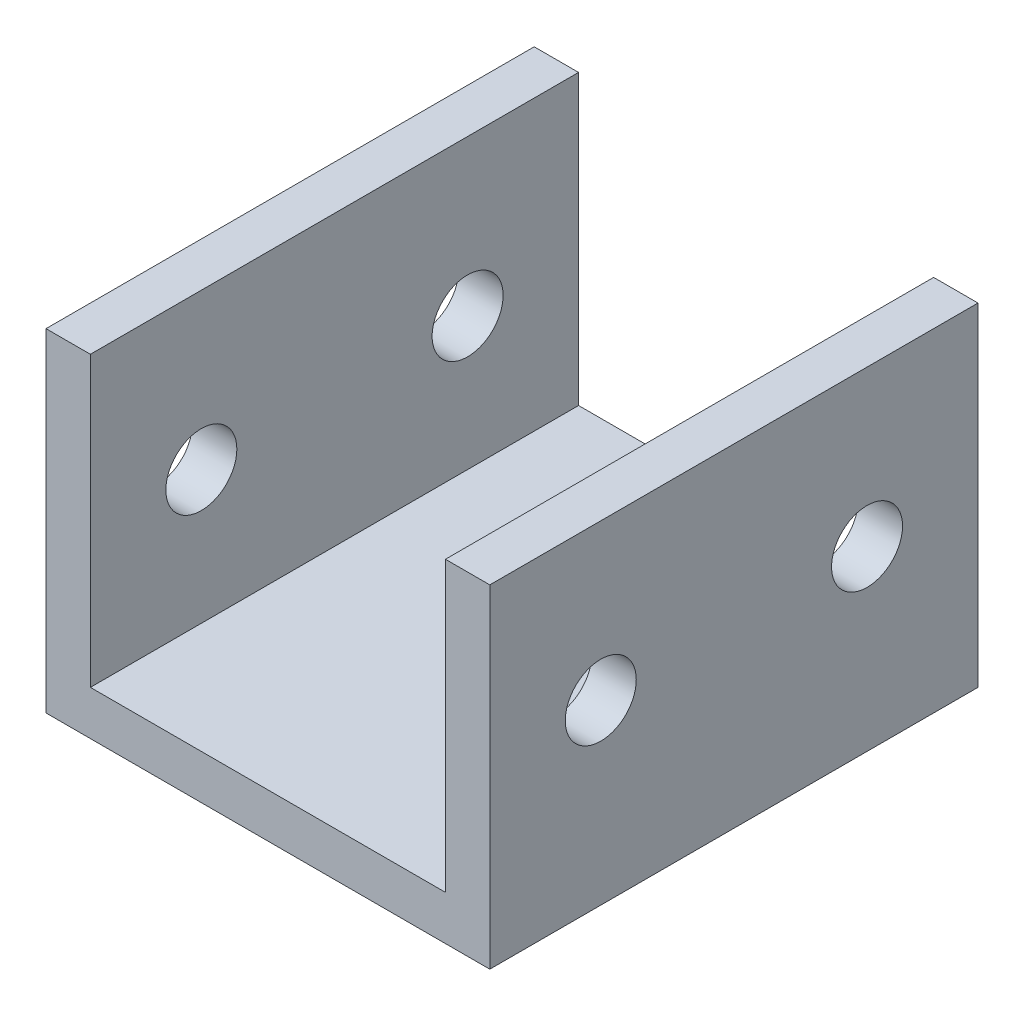
ISO-10303-21;
HEADER;
FILE_DESCRIPTION(('STEP AP214'),'2;1');
FILE_NAME('part.step','',(''),(''),'','','');
FILE_SCHEMA(('AUTOMOTIVE_DESIGN { 1 0 10303 214 1 1 1 1 }'));
ENDSEC;
DATA;
#1=APPLICATION_CONTEXT('core data for automotive mechanical design processes');
#2=APPLICATION_PROTOCOL_DEFINITION('international standard','automotive_design',2000,#1);
#3=PRODUCT_CONTEXT('',#1,'mechanical');
#4=PRODUCT('Part','Part','',(#3));
#5=PRODUCT_RELATED_PRODUCT_CATEGORY('part','',(#4));
#6=PRODUCT_DEFINITION_FORMATION('','',#4);
#7=PRODUCT_DEFINITION_CONTEXT('part definition',#1,'design');
#8=PRODUCT_DEFINITION('design','',#6,#7);
#9=PRODUCT_DEFINITION_SHAPE('','',#8);
#10=(LENGTH_UNIT() NAMED_UNIT(*) SI_UNIT(.MILLI.,.METRE.));
#11=(NAMED_UNIT(*) PLANE_ANGLE_UNIT() SI_UNIT($,.RADIAN.));
#12=(NAMED_UNIT(*) SI_UNIT($,.STERADIAN.) SOLID_ANGLE_UNIT());
#13=UNCERTAINTY_MEASURE_WITH_UNIT(LENGTH_MEASURE(1.E-05),#10,'distance_accuracy_value','');
#14=(GEOMETRIC_REPRESENTATION_CONTEXT(3) GLOBAL_UNCERTAINTY_ASSIGNED_CONTEXT((#13)) GLOBAL_UNIT_ASSIGNED_CONTEXT((#10,
#11,#12)) REPRESENTATION_CONTEXT('',''));
#15=CARTESIAN_POINT('',(0.,0.,0.));
#16=DIRECTION('',(0.,0.,1.));
#17=DIRECTION('',(1.,0.,0.));
#18=AXIS2_PLACEMENT_3D('',#15,#16,#17);
#19=CARTESIAN_POINT('',(9.99999999999999,0.,22.));
#20=DIRECTION('',(-1.,0.,0.));
#21=DIRECTION('',(0.,-1.,0.));
#22=AXIS2_PLACEMENT_3D('',#19,#20,#21);
#23=PLANE('',#22);
#24=CARTESIAN_POINT('',(10.,8.,5.));
#25=DIRECTION('',(1.,0.,0.));
#26=DIRECTION('',(0.,0.,-1.));
#27=AXIS2_PLACEMENT_3D('',#24,#25,#26);
#28=CIRCLE('',#27,1.6);
#29=CARTESIAN_POINT('',(10.,8.,3.4));
#30=VERTEX_POINT('',#29);
#31=EDGE_CURVE('E204',#30,#30,#28,.T.);
#32=ORIENTED_EDGE('',*,*,#31,.F.);
#33=EDGE_LOOP('',(#32));
#34=FACE_BOUND('',#33,.T.);
#35=DIRECTION('',(0.,1.,0.));
#36=VECTOR('',#35,1.);
#37=CARTESIAN_POINT('',(9.99999999999999,0.,0.));
#38=LINE('',#37,#36);
#39=CARTESIAN_POINT('',(9.99999999999999,0.,0.));
#40=VERTEX_POINT('',#39);
#41=CARTESIAN_POINT('',(10.,15.,0.));
#42=VERTEX_POINT('',#41);
#43=EDGE_CURVE('E100',#40,#42,#38,.T.);
#44=ORIENTED_EDGE('',*,*,#43,.T.);
#45=DIRECTION('',(0.,0.,-1.));
#46=VECTOR('',#45,1.);
#47=CARTESIAN_POINT('',(10.,15.,22.));
#48=LINE('',#47,#46);
#49=CARTESIAN_POINT('',(10.,15.,22.));
#50=VERTEX_POINT('',#49);
#51=EDGE_CURVE('E11',#50,#42,#48,.T.);
#52=ORIENTED_EDGE('',*,*,#51,.F.);
#53=DIRECTION('',(0.,1.,0.));
#54=VECTOR('',#53,1.);
#55=CARTESIAN_POINT('',(9.99999999999999,0.,22.));
#56=LINE('',#55,#54);
#57=CARTESIAN_POINT('',(9.99999999999999,0.,22.));
#58=VERTEX_POINT('',#57);
#59=EDGE_CURVE('E137',#58,#50,#56,.T.);
#60=ORIENTED_EDGE('',*,*,#59,.F.);
#61=DIRECTION('',(0.,0.,-1.));
#62=VECTOR('',#61,1.);
#63=CARTESIAN_POINT('',(9.99999999999999,0.,22.));
#64=LINE('',#63,#62);
#65=EDGE_CURVE('E114',#58,#40,#64,.T.);
#66=ORIENTED_EDGE('',*,*,#65,.T.);
#67=EDGE_LOOP('',(#44,#52,#60,#66));
#68=FACE_BOUND('',#67,.T.);
#69=CARTESIAN_POINT('',(10.,8.,17.));
#70=DIRECTION('',(1.,0.,0.));
#71=DIRECTION('',(0.,0.,-1.));
#72=AXIS2_PLACEMENT_3D('',#69,#70,#71);
#73=CIRCLE('',#72,1.6);
#74=CARTESIAN_POINT('',(10.,8.,15.4));
#75=VERTEX_POINT('',#74);
#76=EDGE_CURVE('E301',#75,#75,#73,.T.);
#77=ORIENTED_EDGE('',*,*,#76,.F.);
#78=EDGE_LOOP('',(#77));
#79=FACE_BOUND('',#78,.T.);
#80=ADVANCED_FACE('F30',(#34,#68,#79),#23,.F.);
#81=CARTESIAN_POINT('',(8.,15.,22.));
#82=DIRECTION('',(1.,0.,0.));
#83=DIRECTION('',(0.,1.,0.));
#84=AXIS2_PLACEMENT_3D('',#81,#82,#83);
#85=PLANE('',#84);
#86=CARTESIAN_POINT('',(8.,8.,5.));
#87=DIRECTION('',(1.,0.,0.));
#88=DIRECTION('',(0.,1.,0.));
#89=AXIS2_PLACEMENT_3D('',#86,#87,#88);
#90=CIRCLE('',#89,1.6);
#91=CARTESIAN_POINT('',(8.,9.6,5.));
#92=VERTEX_POINT('',#91);
#93=EDGE_CURVE('E115',#92,#92,#90,.F.);
#94=ORIENTED_EDGE('',*,*,#93,.F.);
#95=EDGE_LOOP('',(#94));
#96=FACE_BOUND('',#95,.T.);
#97=DIRECTION('',(0.,-1.,0.));
#98=VECTOR('',#97,1.);
#99=CARTESIAN_POINT('',(8.,15.,0.));
#100=LINE('',#99,#98);
#101=CARTESIAN_POINT('',(8.,15.,0.));
#102=VERTEX_POINT('',#101);
#103=CARTESIAN_POINT('',(8.,2.,0.));
#104=VERTEX_POINT('',#103);
#105=EDGE_CURVE('E102',#102,#104,#100,.T.);
#106=ORIENTED_EDGE('',*,*,#105,.T.);
#107=DIRECTION('',(0.,0.,-1.));
#108=VECTOR('',#107,1.);
#109=CARTESIAN_POINT('',(8.,2.,22.));
#110=LINE('',#109,#108);
#111=CARTESIAN_POINT('',(8.,2.,22.));
#112=VERTEX_POINT('',#111);
#113=EDGE_CURVE('E161',#112,#104,#110,.T.);
#114=ORIENTED_EDGE('',*,*,#113,.F.);
#115=DIRECTION('',(0.,-1.,0.));
#116=VECTOR('',#115,1.);
#117=CARTESIAN_POINT('',(8.,15.,22.));
#118=LINE('',#117,#116);
#119=CARTESIAN_POINT('',(8.,15.,22.));
#120=VERTEX_POINT('',#119);
#121=EDGE_CURVE('E140',#120,#112,#118,.T.);
#122=ORIENTED_EDGE('',*,*,#121,.F.);
#123=DIRECTION('',(0.,0.,-1.));
#124=VECTOR('',#123,1.);
#125=CARTESIAN_POINT('',(8.,15.,22.));
#126=LINE('',#125,#124);
#127=EDGE_CURVE('E37',#120,#102,#126,.T.);
#128=ORIENTED_EDGE('',*,*,#127,.T.);
#129=EDGE_LOOP('',(#106,#114,#122,#128));
#130=FACE_BOUND('',#129,.T.);
#131=CARTESIAN_POINT('',(8.,8.,17.));
#132=DIRECTION('',(1.,0.,0.));
#133=DIRECTION('',(0.,1.,0.));
#134=AXIS2_PLACEMENT_3D('',#131,#132,#133);
#135=CIRCLE('',#134,1.6);
#136=CARTESIAN_POINT('',(8.,9.6,17.));
#137=VERTEX_POINT('',#136);
#138=EDGE_CURVE('E207',#137,#137,#135,.F.);
#139=ORIENTED_EDGE('',*,*,#138,.F.);
#140=EDGE_LOOP('',(#139));
#141=FACE_BOUND('',#140,.T.);
#142=ADVANCED_FACE('F165',(#96,#130,#141),#85,.F.);
#143=CARTESIAN_POINT('',(-8.00000000000001,15.,22.));
#144=DIRECTION('',(1.,0.,0.));
#145=DIRECTION('',(0.,0.,-1.));
#146=AXIS2_PLACEMENT_3D('',#143,#144,#145);
#147=PLANE('',#146);
#148=CARTESIAN_POINT('',(-8.00000000000001,8.,5.));
#149=DIRECTION('',(1.,0.,0.));
#150=DIRECTION('',(0.,0.,-1.));
#151=AXIS2_PLACEMENT_3D('',#148,#149,#150);
#152=CIRCLE('',#151,1.6);
#153=CARTESIAN_POINT('',(-8.00000000000001,8.,3.4));
#154=VERTEX_POINT('',#153);
#155=EDGE_CURVE('E118',#154,#154,#152,.F.);
#156=ORIENTED_EDGE('',*,*,#155,.T.);
#157=EDGE_LOOP('',(#156));
#158=FACE_BOUND('',#157,.T.);
#159=DIRECTION('',(0.,-1.,0.));
#160=VECTOR('',#159,1.);
#161=CARTESIAN_POINT('',(-8.00000000000001,15.,0.));
#162=LINE('',#161,#160);
#163=CARTESIAN_POINT('',(-8.00000000000001,15.,0.));
#164=VERTEX_POINT('',#163);
#165=CARTESIAN_POINT('',(-8.00000000000001,2.,0.));
#166=VERTEX_POINT('',#165);
#167=EDGE_CURVE('E126',#164,#166,#162,.T.);
#168=ORIENTED_EDGE('',*,*,#167,.F.);
#169=DIRECTION('',(0.,0.,-1.));
#170=VECTOR('',#169,1.);
#171=CARTESIAN_POINT('',(-8.00000000000001,15.,22.));
#172=LINE('',#171,#170);
#173=CARTESIAN_POINT('',(-8.00000000000001,15.,22.));
#174=VERTEX_POINT('',#173);
#175=EDGE_CURVE('E157',#174,#164,#172,.T.);
#176=ORIENTED_EDGE('',*,*,#175,.F.);
#177=DIRECTION('',(0.,-1.,0.));
#178=VECTOR('',#177,1.);
#179=CARTESIAN_POINT('',(-8.00000000000001,15.,22.));
#180=LINE('',#179,#178);
#181=CARTESIAN_POINT('',(-8.00000000000001,2.,22.));
#182=VERTEX_POINT('',#181);
#183=EDGE_CURVE('E144',#174,#182,#180,.T.);
#184=ORIENTED_EDGE('',*,*,#183,.T.);
#185=DIRECTION('',(0.,0.,-1.));
#186=VECTOR('',#185,1.);
#187=CARTESIAN_POINT('',(-8.00000000000001,2.,22.));
#188=LINE('',#187,#186);
#189=EDGE_CURVE('E159',#182,#166,#188,.T.);
#190=ORIENTED_EDGE('',*,*,#189,.T.);
#191=EDGE_LOOP('',(#168,#176,#184,#190));
#192=FACE_BOUND('',#191,.T.);
#193=CARTESIAN_POINT('',(-8.00000000000001,8.,17.));
#194=DIRECTION('',(1.,0.,0.));
#195=DIRECTION('',(0.,0.,-1.));
#196=AXIS2_PLACEMENT_3D('',#193,#194,#195);
#197=CIRCLE('',#196,1.6);
#198=CARTESIAN_POINT('',(-8.00000000000001,8.,15.4));
#199=VERTEX_POINT('',#198);
#200=EDGE_CURVE('E212',#199,#199,#197,.F.);
#201=ORIENTED_EDGE('',*,*,#200,.T.);
#202=EDGE_LOOP('',(#201));
#203=FACE_BOUND('',#202,.T.);
#204=ADVANCED_FACE('F177',(#158,#192,#203),#147,.T.);
#205=CARTESIAN_POINT('',(-10.,0.,22.));
#206=DIRECTION('',(-1.,0.,0.));
#207=DIRECTION('',(0.,-1.,0.));
#208=AXIS2_PLACEMENT_3D('',#205,#206,#207);
#209=PLANE('',#208);
#210=CARTESIAN_POINT('',(-10.,8.,5.));
#211=DIRECTION('',(1.,0.,0.));
#212=DIRECTION('',(0.,0.,-1.));
#213=AXIS2_PLACEMENT_3D('',#210,#211,#212);
#214=CIRCLE('',#213,1.6);
#215=CARTESIAN_POINT('',(-10.,8.,3.4));
#216=VERTEX_POINT('',#215);
#217=EDGE_CURVE('E206',#216,#216,#214,.T.);
#218=ORIENTED_EDGE('',*,*,#217,.T.);
#219=EDGE_LOOP('',(#218));
#220=FACE_BOUND('',#219,.T.);
#221=DIRECTION('',(0.,1.,0.));
#222=VECTOR('',#221,1.);
#223=CARTESIAN_POINT('',(-10.,0.,0.));
#224=LINE('',#223,#222);
#225=CARTESIAN_POINT('',(-10.,0.,0.));
#226=VERTEX_POINT('',#225);
#227=CARTESIAN_POINT('',(-10.,15.,0.));
#228=VERTEX_POINT('',#227);
#229=EDGE_CURVE('E132',#226,#228,#224,.T.);
#230=ORIENTED_EDGE('',*,*,#229,.F.);
#231=DIRECTION('',(0.,0.,-1.));
#232=VECTOR('',#231,1.);
#233=CARTESIAN_POINT('',(-10.,0.,22.));
#234=LINE('',#233,#232);
#235=CARTESIAN_POINT('',(-10.,0.,22.));
#236=VERTEX_POINT('',#235);
#237=EDGE_CURVE('E52',#236,#226,#234,.T.);
#238=ORIENTED_EDGE('',*,*,#237,.F.);
#239=DIRECTION('',(0.,1.,0.));
#240=VECTOR('',#239,1.);
#241=CARTESIAN_POINT('',(-10.,0.,22.));
#242=LINE('',#241,#240);
#243=CARTESIAN_POINT('',(-10.,15.,22.));
#244=VERTEX_POINT('',#243);
#245=EDGE_CURVE('E150',#236,#244,#242,.T.);
#246=ORIENTED_EDGE('',*,*,#245,.T.);
#247=DIRECTION('',(0.,0.,-1.));
#248=VECTOR('',#247,1.);
#249=CARTESIAN_POINT('',(-10.,15.,22.));
#250=LINE('',#249,#248);
#251=EDGE_CURVE('E155',#244,#228,#250,.T.);
#252=ORIENTED_EDGE('',*,*,#251,.T.);
#253=EDGE_LOOP('',(#230,#238,#246,#252));
#254=FACE_BOUND('',#253,.T.);
#255=CARTESIAN_POINT('',(-10.,8.,17.));
#256=DIRECTION('',(1.,0.,0.));
#257=DIRECTION('',(0.,0.,-1.));
#258=AXIS2_PLACEMENT_3D('',#255,#256,#257);
#259=CIRCLE('',#258,1.6);
#260=CARTESIAN_POINT('',(-10.,8.,15.4));
#261=VERTEX_POINT('',#260);
#262=EDGE_CURVE('E303',#261,#261,#259,.T.);
#263=ORIENTED_EDGE('',*,*,#262,.T.);
#264=EDGE_LOOP('',(#263));
#265=FACE_BOUND('',#264,.T.);
#266=ADVANCED_FACE('F182',(#220,#254,#265),#209,.T.);
#267=CARTESIAN_POINT('',(10.,15.,22.));
#268=DIRECTION('',(0.,-1.,0.));
#269=DIRECTION('',(0.,0.,-1.));
#270=AXIS2_PLACEMENT_3D('',#267,#268,#269);
#271=PLANE('',#270);
#272=DIRECTION('',(-1.,0.,0.));
#273=VECTOR('',#272,1.);
#274=CARTESIAN_POINT('',(10.,15.,0.));
#275=LINE('',#274,#273);
#276=EDGE_CURVE('E96',#42,#102,#275,.T.);
#277=ORIENTED_EDGE('',*,*,#276,.T.);
#278=ORIENTED_EDGE('',*,*,#127,.F.);
#279=DIRECTION('',(-1.,0.,0.));
#280=VECTOR('',#279,1.);
#281=CARTESIAN_POINT('',(10.,15.,22.));
#282=LINE('',#281,#280);
#283=EDGE_CURVE('E109',#50,#120,#282,.T.);
#284=ORIENTED_EDGE('',*,*,#283,.F.);
#285=ORIENTED_EDGE('',*,*,#51,.T.);
#286=EDGE_LOOP('',(#277,#278,#284,#285));
#287=FACE_BOUND('',#286,.T.);
#288=ADVANCED_FACE('F108',(#287),#271,.F.);
#289=CARTESIAN_POINT('',(8.,2.,22.));
#290=DIRECTION('',(0.,-1.,0.));
#291=DIRECTION('',(1.,0.,0.));
#292=AXIS2_PLACEMENT_3D('',#289,#290,#291);
#293=PLANE('',#292);
#294=DIRECTION('',(-1.,0.,0.));
#295=VECTOR('',#294,1.);
#296=CARTESIAN_POINT('',(8.,2.,0.));
#297=LINE('',#296,#295);
#298=EDGE_CURVE('E123',#104,#166,#297,.T.);
#299=ORIENTED_EDGE('',*,*,#298,.T.);
#300=ORIENTED_EDGE('',*,*,#189,.F.);
#301=DIRECTION('',(-1.,0.,0.));
#302=VECTOR('',#301,1.);
#303=CARTESIAN_POINT('',(8.,2.,22.));
#304=LINE('',#303,#302);
#305=EDGE_CURVE('E142',#112,#182,#304,.T.);
#306=ORIENTED_EDGE('',*,*,#305,.F.);
#307=ORIENTED_EDGE('',*,*,#113,.T.);
#308=EDGE_LOOP('',(#299,#300,#306,#307));
#309=FACE_BOUND('',#308,.T.);
#310=ADVANCED_FACE('F174',(#309),#293,.F.);
#311=CARTESIAN_POINT('',(-10.,15.,22.));
#312=DIRECTION('',(0.,1.,0.));
#313=DIRECTION('',(0.,0.,1.));
#314=AXIS2_PLACEMENT_3D('',#311,#312,#313);
#315=PLANE('',#314);
#316=DIRECTION('',(1.,0.,0.));
#317=VECTOR('',#316,1.);
#318=CARTESIAN_POINT('',(-10.,15.,0.));
#319=LINE('',#318,#317);
#320=EDGE_CURVE('E129',#228,#164,#319,.T.);
#321=ORIENTED_EDGE('',*,*,#320,.F.);
#322=ORIENTED_EDGE('',*,*,#251,.F.);
#323=DIRECTION('',(1.,0.,0.));
#324=VECTOR('',#323,1.);
#325=CARTESIAN_POINT('',(-10.,15.,22.));
#326=LINE('',#325,#324);
#327=EDGE_CURVE('E147',#244,#174,#326,.T.);
#328=ORIENTED_EDGE('',*,*,#327,.T.);
#329=ORIENTED_EDGE('',*,*,#175,.T.);
#330=EDGE_LOOP('',(#321,#322,#328,#329));
#331=FACE_BOUND('',#330,.T.);
#332=ADVANCED_FACE('F181',(#331),#315,.T.);
#333=CARTESIAN_POINT('',(-10.,0.,22.));
#334=DIRECTION('',(0.,1.,0.));
#335=DIRECTION('',(-1.,0.,0.));
#336=AXIS2_PLACEMENT_3D('',#333,#334,#335);
#337=PLANE('',#336);
#338=DIRECTION('',(1.,0.,0.));
#339=VECTOR('',#338,1.);
#340=CARTESIAN_POINT('',(-10.,0.,0.));
#341=LINE('',#340,#339);
#342=EDGE_CURVE('E135',#226,#40,#341,.T.);
#343=ORIENTED_EDGE('',*,*,#342,.T.);
#344=ORIENTED_EDGE('',*,*,#65,.F.);
#345=DIRECTION('',(1.,0.,0.));
#346=VECTOR('',#345,1.);
#347=CARTESIAN_POINT('',(-10.,0.,22.));
#348=LINE('',#347,#346);
#349=EDGE_CURVE('E44',#236,#58,#348,.T.);
#350=ORIENTED_EDGE('',*,*,#349,.F.);
#351=ORIENTED_EDGE('',*,*,#237,.T.);
#352=EDGE_LOOP('',(#343,#344,#350,#351));
#353=FACE_BOUND('',#352,.T.);
#354=ADVANCED_FACE('F185',(#353),#337,.F.);
#355=CARTESIAN_POINT('',(9.99999999999999,0.,22.));
#356=DIRECTION('',(0.,0.,-1.));
#357=DIRECTION('',(-1.,0.,0.));
#358=AXIS2_PLACEMENT_3D('',#355,#356,#357);
#359=PLANE('',#358);
#360=ORIENTED_EDGE('',*,*,#59,.T.);
#361=ORIENTED_EDGE('',*,*,#283,.T.);
#362=ORIENTED_EDGE('',*,*,#121,.T.);
#363=ORIENTED_EDGE('',*,*,#305,.T.);
#364=ORIENTED_EDGE('',*,*,#183,.F.);
#365=ORIENTED_EDGE('',*,*,#327,.F.);
#366=ORIENTED_EDGE('',*,*,#245,.F.);
#367=ORIENTED_EDGE('',*,*,#349,.T.);
#368=EDGE_LOOP('',(#360,#361,#362,#363,#364,#365,#366,#367));
#369=FACE_BOUND('',#368,.T.);
#370=ADVANCED_FACE('F169',(#369),#359,.F.);
#371=CARTESIAN_POINT('',(9.99999999999999,0.,0.));
#372=DIRECTION('',(0.,0.,-1.));
#373=DIRECTION('',(-1.,0.,0.));
#374=AXIS2_PLACEMENT_3D('',#371,#372,#373);
#375=PLANE('',#374);
#376=ORIENTED_EDGE('',*,*,#43,.F.);
#377=ORIENTED_EDGE('',*,*,#342,.F.);
#378=ORIENTED_EDGE('',*,*,#229,.T.);
#379=ORIENTED_EDGE('',*,*,#320,.T.);
#380=ORIENTED_EDGE('',*,*,#167,.T.);
#381=ORIENTED_EDGE('',*,*,#298,.F.);
#382=ORIENTED_EDGE('',*,*,#105,.F.);
#383=ORIENTED_EDGE('',*,*,#276,.F.);
#384=EDGE_LOOP('',(#376,#377,#378,#379,#380,#381,#382,#383));
#385=FACE_BOUND('',#384,.T.);
#386=ADVANCED_FACE('F97',(#385),#375,.T.);
#387=CARTESIAN_POINT('',(10.,8.,5.));
#388=DIRECTION('',(1.,0.,0.));
#389=DIRECTION('',(0.,0.,-1.));
#390=AXIS2_PLACEMENT_3D('',#387,#388,#389);
#391=CYLINDRICAL_SURFACE('',#390,1.6);
#392=ORIENTED_EDGE('',*,*,#155,.F.);
#393=EDGE_LOOP('',(#392));
#394=FACE_BOUND('',#393,.T.);
#395=ORIENTED_EDGE('',*,*,#217,.F.);
#396=EDGE_LOOP('',(#395));
#397=FACE_BOUND('',#396,.T.);
#398=ADVANCED_FACE('F219',(#394,#397),#391,.F.);
#399=ORIENTED_EDGE('',*,*,#31,.T.);
#400=EDGE_LOOP('',(#399));
#401=FACE_BOUND('',#400,.T.);
#402=ORIENTED_EDGE('',*,*,#93,.T.);
#403=EDGE_LOOP('',(#402));
#404=FACE_BOUND('',#403,.T.);
#405=ADVANCED_FACE('F222',(#401,#404),#391,.F.);
#406=CARTESIAN_POINT('',(10.,8.,17.));
#407=DIRECTION('',(1.,0.,0.));
#408=DIRECTION('',(0.,0.,-1.));
#409=AXIS2_PLACEMENT_3D('',#406,#407,#408);
#410=CYLINDRICAL_SURFACE('',#409,1.6);
#411=ORIENTED_EDGE('',*,*,#200,.F.);
#412=EDGE_LOOP('',(#411));
#413=FACE_BOUND('',#412,.T.);
#414=ORIENTED_EDGE('',*,*,#262,.F.);
#415=EDGE_LOOP('',(#414));
#416=FACE_BOUND('',#415,.T.);
#417=ADVANCED_FACE('F275',(#413,#416),#410,.F.);
#418=ORIENTED_EDGE('',*,*,#76,.T.);
#419=EDGE_LOOP('',(#418));
#420=FACE_BOUND('',#419,.T.);
#421=ORIENTED_EDGE('',*,*,#138,.T.);
#422=EDGE_LOOP('',(#421));
#423=FACE_BOUND('',#422,.T.);
#424=ADVANCED_FACE('F284',(#420,#423),#410,.F.);
#425=CLOSED_SHELL('',(#80,#142,#204,#266,#288,#310,#332,#354,#370,#386,#398,#405,#417,#424));
#426=MANIFOLD_SOLID_BREP('B2',#425);
#427=ADVANCED_BREP_SHAPE_REPRESENTATION('',(#18,#426),#14);
#428=SHAPE_DEFINITION_REPRESENTATION(#9,#427);
ENDSEC;
END-ISO-10303-21;
